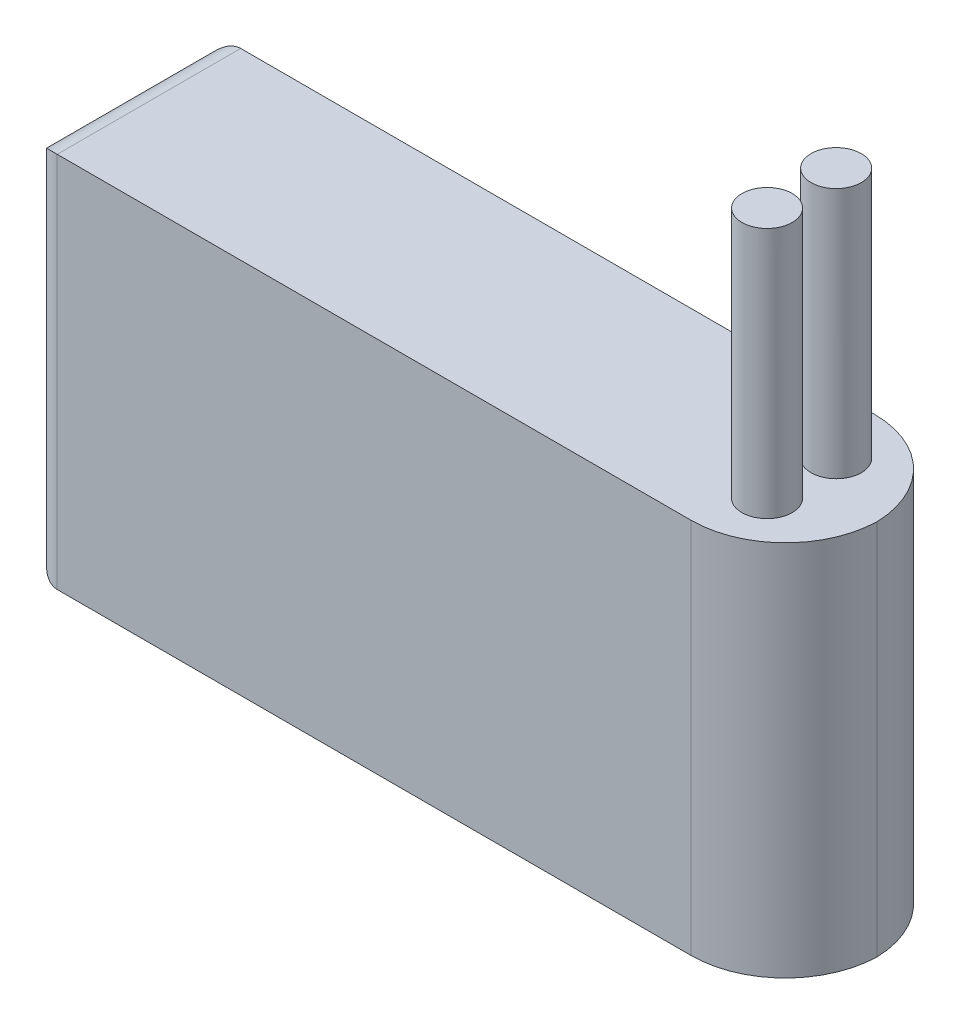
ISO-10303-21;
HEADER;
FILE_DESCRIPTION(('STEP AP214'),'2;1');
FILE_NAME('part.step','',(''),(''),'','','');
FILE_SCHEMA(('AUTOMOTIVE_DESIGN { 1 0 10303 214 1 1 1 1 }'));
ENDSEC;
DATA;
#1=APPLICATION_CONTEXT('core data for automotive mechanical design processes');
#2=APPLICATION_PROTOCOL_DEFINITION('international standard','automotive_design',2000,#1);
#3=PRODUCT_CONTEXT('',#1,'mechanical');
#4=PRODUCT('Part','Part','',(#3));
#5=PRODUCT_RELATED_PRODUCT_CATEGORY('part','',(#4));
#6=PRODUCT_DEFINITION_FORMATION('','',#4);
#7=PRODUCT_DEFINITION_CONTEXT('part definition',#1,'design');
#8=PRODUCT_DEFINITION('design','',#6,#7);
#9=PRODUCT_DEFINITION_SHAPE('','',#8);
#10=(LENGTH_UNIT() NAMED_UNIT(*) SI_UNIT(.MILLI.,.METRE.));
#11=(NAMED_UNIT(*) PLANE_ANGLE_UNIT() SI_UNIT($,.RADIAN.));
#12=(NAMED_UNIT(*) SI_UNIT($,.STERADIAN.) SOLID_ANGLE_UNIT());
#13=UNCERTAINTY_MEASURE_WITH_UNIT(LENGTH_MEASURE(1.E-05),#10,'distance_accuracy_value','');
#14=(GEOMETRIC_REPRESENTATION_CONTEXT(3) GLOBAL_UNCERTAINTY_ASSIGNED_CONTEXT((#13)) GLOBAL_UNIT_ASSIGNED_CONTEXT((#10,
#11,#12)) REPRESENTATION_CONTEXT('',''));
#15=CARTESIAN_POINT('',(0.,0.,0.));
#16=DIRECTION('',(0.,0.,1.));
#17=DIRECTION('',(1.,0.,0.));
#18=AXIS2_PLACEMENT_3D('',#15,#16,#17);
#19=CARTESIAN_POINT('',(0.,0.,18.542));
#20=DIRECTION('',(1.,0.,0.));
#21=DIRECTION('',(0.,0.,-1.));
#22=AXIS2_PLACEMENT_3D('',#19,#20,#21);
#23=PLANE('',#22);
#24=DIRECTION('',(0.,-1.,0.));
#25=VECTOR('',#24,1.);
#26=CARTESIAN_POINT('',(0.,0.,15.9385));
#27=LINE('',#26,#25);
#28=CARTESIAN_POINT('',(0.,2.6035,15.9385));
#29=VERTEX_POINT('',#28);
#30=CARTESIAN_POINT('',(0.,35.4965,15.9385));
#31=VERTEX_POINT('',#30);
#32=EDGE_CURVE('E159',#29,#31,#27,.F.);
#33=ORIENTED_EDGE('',*,*,#32,.T.);
#34=DIRECTION('',(0.,0.,-1.));
#35=VECTOR('',#34,1.);
#36=CARTESIAN_POINT('',(0.,35.4965,18.542));
#37=LINE('',#36,#35);
#38=CARTESIAN_POINT('',(0.,35.4965,2.6035));
#39=VERTEX_POINT('',#38);
#40=EDGE_CURVE('E162',#31,#39,#37,.T.);
#41=ORIENTED_EDGE('',*,*,#40,.T.);
#42=DIRECTION('',(0.,-1.,0.));
#43=VECTOR('',#42,1.);
#44=CARTESIAN_POINT('',(0.,0.,2.6035));
#45=LINE('',#44,#43);
#46=CARTESIAN_POINT('',(0.,2.6035,2.6035));
#47=VERTEX_POINT('',#46);
#48=EDGE_CURVE('E153',#39,#47,#45,.T.);
#49=ORIENTED_EDGE('',*,*,#48,.T.);
#50=DIRECTION('',(0.,0.,-1.));
#51=VECTOR('',#50,1.);
#52=CARTESIAN_POINT('',(0.,2.6035,18.542));
#53=LINE('',#52,#51);
#54=EDGE_CURVE('E156',#47,#29,#53,.F.);
#55=ORIENTED_EDGE('',*,*,#54,.T.);
#56=EDGE_LOOP('',(#33,#41,#49,#55));
#57=FACE_BOUND('',#56,.T.);
#58=ADVANCED_FACE('F41',(#57),#23,.F.);
#59=CARTESIAN_POINT('',(0.,0.,18.542));
#60=DIRECTION('',(0.,1.,0.));
#61=DIRECTION('',(0.,0.,1.));
#62=AXIS2_PLACEMENT_3D('',#59,#60,#61);
#63=PLANE('',#62);
#64=DIRECTION('',(1.,0.,0.));
#65=VECTOR('',#64,1.);
#66=CARTESIAN_POINT('',(0.,0.,18.542));
#67=LINE('',#66,#65);
#68=CARTESIAN_POINT('',(2.6035,0.,18.542));
#69=VERTEX_POINT('',#68);
#70=CARTESIAN_POINT('',(66.675,0.,18.542));
#71=VERTEX_POINT('',#70);
#72=EDGE_CURVE('E100',#69,#71,#67,.T.);
#73=ORIENTED_EDGE('',*,*,#72,.F.);
#74=DIRECTION('',(0.,0.,-1.));
#75=VECTOR('',#74,1.);
#76=CARTESIAN_POINT('',(2.6035,0.,18.542));
#77=LINE('',#76,#75);
#78=CARTESIAN_POINT('',(2.6035,0.,0.));
#79=VERTEX_POINT('',#78);
#80=EDGE_CURVE('E51',#69,#79,#77,.T.);
#81=ORIENTED_EDGE('',*,*,#80,.T.);
#82=DIRECTION('',(1.,0.,0.));
#83=VECTOR('',#82,1.);
#84=CARTESIAN_POINT('',(0.,0.,0.));
#85=LINE('',#84,#83);
#86=CARTESIAN_POINT('',(66.675,0.,0.));
#87=VERTEX_POINT('',#86);
#88=EDGE_CURVE('E144',#79,#87,#85,.T.);
#89=ORIENTED_EDGE('',*,*,#88,.T.);
#90=CARTESIAN_POINT('',(66.675,0.,9.525));
#91=DIRECTION('',(0.,1.,0.));
#92=DIRECTION('',(0.,0.,1.));
#93=AXIS2_PLACEMENT_3D('',#90,#91,#92);
#94=CIRCLE('',#93,9.525);
#95=CARTESIAN_POINT('',(76.1966127310451,0.,9.271));
#96=VERTEX_POINT('',#95);
#97=EDGE_CURVE('E114',#87,#96,#94,.F.);
#98=ORIENTED_EDGE('',*,*,#97,.T.);
#99=CARTESIAN_POINT('',(66.675,0.,9.017));
#100=DIRECTION('',(0.,1.,0.));
#101=DIRECTION('',(0.,0.,1.));
#102=AXIS2_PLACEMENT_3D('',#99,#100,#101);
#103=CIRCLE('',#102,9.525);
#104=EDGE_CURVE('E111',#96,#71,#103,.F.);
#105=ORIENTED_EDGE('',*,*,#104,.T.);
#106=EDGE_LOOP('',(#73,#81,#89,#98,#105));
#107=FACE_BOUND('',#106,.T.);
#108=ADVANCED_FACE('F112',(#107),#63,.F.);
#109=CARTESIAN_POINT('',(0.,38.1,18.542));
#110=DIRECTION('',(0.,-1.,0.));
#111=DIRECTION('',(0.,0.,-1.));
#112=AXIS2_PLACEMENT_3D('',#109,#110,#111);
#113=PLANE('',#112);
#114=CARTESIAN_POINT('',(68.5766127310451,38.1,12.7635));
#115=DIRECTION('',(0.,-1.,0.));
#116=DIRECTION('',(0.,0.,-1.));
#117=AXIS2_PLACEMENT_3D('',#114,#115,#116);
#118=CIRCLE('',#117,2.54);
#119=CARTESIAN_POINT('',(68.5766127310451,38.1,10.2235));
#120=VERTEX_POINT('',#119);
#121=EDGE_CURVE('E149',#120,#120,#118,.F.);
#122=ORIENTED_EDGE('',*,*,#121,.F.);
#123=EDGE_LOOP('',(#122));
#124=FACE_BOUND('',#123,.T.);
#125=CARTESIAN_POINT('',(68.5766127310451,38.1,5.7785));
#126=DIRECTION('',(0.,-1.,0.));
#127=DIRECTION('',(0.,0.,-1.));
#128=AXIS2_PLACEMENT_3D('',#125,#126,#127);
#129=CIRCLE('',#128,2.54);
#130=CARTESIAN_POINT('',(68.5766127310451,38.1,3.2385));
#131=VERTEX_POINT('',#130);
#132=EDGE_CURVE('E140',#131,#131,#129,.F.);
#133=ORIENTED_EDGE('',*,*,#132,.F.);
#134=EDGE_LOOP('',(#133));
#135=FACE_BOUND('',#134,.T.);
#136=DIRECTION('',(-1.,0.,0.));
#137=VECTOR('',#136,1.);
#138=CARTESIAN_POINT('',(0.,38.1,0.));
#139=LINE('',#138,#137);
#140=CARTESIAN_POINT('',(66.675,38.1,0.));
#141=VERTEX_POINT('',#140);
#142=CARTESIAN_POINT('',(2.6035,38.1,0.));
#143=VERTEX_POINT('',#142);
#144=EDGE_CURVE('E108',#141,#143,#139,.T.);
#145=ORIENTED_EDGE('',*,*,#144,.T.);
#146=DIRECTION('',(0.,0.,-1.));
#147=VECTOR('',#146,1.);
#148=CARTESIAN_POINT('',(2.6035,38.1,18.542));
#149=LINE('',#148,#147);
#150=CARTESIAN_POINT('',(2.6035,38.1,18.542));
#151=VERTEX_POINT('',#150);
#152=EDGE_CURVE('E166',#143,#151,#149,.F.);
#153=ORIENTED_EDGE('',*,*,#152,.T.);
#154=DIRECTION('',(-1.,0.,0.));
#155=VECTOR('',#154,1.);
#156=CARTESIAN_POINT('',(0.,38.1,18.542));
#157=LINE('',#156,#155);
#158=CARTESIAN_POINT('',(66.675,38.1,18.542));
#159=VERTEX_POINT('',#158);
#160=EDGE_CURVE('E107',#159,#151,#157,.T.);
#161=ORIENTED_EDGE('',*,*,#160,.F.);
#162=CARTESIAN_POINT('',(66.675,38.1,9.017));
#163=DIRECTION('',(0.,-1.,0.));
#164=DIRECTION('',(0.,0.,-1.));
#165=AXIS2_PLACEMENT_3D('',#162,#163,#164);
#166=CIRCLE('',#165,9.525);
#167=CARTESIAN_POINT('',(76.1966127310451,38.1,9.271));
#168=VERTEX_POINT('',#167);
#169=EDGE_CURVE('E122',#159,#168,#166,.F.);
#170=ORIENTED_EDGE('',*,*,#169,.T.);
#171=CARTESIAN_POINT('',(66.675,38.1,9.525));
#172=DIRECTION('',(0.,-1.,0.));
#173=DIRECTION('',(0.,0.,-1.));
#174=AXIS2_PLACEMENT_3D('',#171,#172,#173);
#175=CIRCLE('',#174,9.525);
#176=EDGE_CURVE('E124',#168,#141,#175,.F.);
#177=ORIENTED_EDGE('',*,*,#176,.T.);
#178=EDGE_LOOP('',(#145,#153,#161,#170,#177));
#179=FACE_BOUND('',#178,.T.);
#180=ADVANCED_FACE('F206',(#124,#135,#179),#113,.F.);
#181=CARTESIAN_POINT('',(0.,0.,18.542));
#182=DIRECTION('',(0.,0.,-1.));
#183=DIRECTION('',(-1.,0.,0.));
#184=AXIS2_PLACEMENT_3D('',#181,#182,#183);
#185=PLANE('',#184);
#186=ORIENTED_EDGE('',*,*,#160,.T.);
#187=DIRECTION('',(0.,-1.,0.));
#188=VECTOR('',#187,1.);
#189=CARTESIAN_POINT('',(2.6035,0.,18.542));
#190=LINE('',#189,#188);
#191=EDGE_CURVE('E66',#151,#69,#190,.T.);
#192=ORIENTED_EDGE('',*,*,#191,.T.);
#193=ORIENTED_EDGE('',*,*,#72,.T.);
#194=DIRECTION('',(0.,1.,0.));
#195=VECTOR('',#194,1.);
#196=CARTESIAN_POINT('',(66.675,0.,18.542));
#197=LINE('',#196,#195);
#198=EDGE_CURVE('E104',#71,#159,#197,.T.);
#199=ORIENTED_EDGE('',*,*,#198,.T.);
#200=EDGE_LOOP('',(#186,#192,#193,#199));
#201=FACE_BOUND('',#200,.T.);
#202=ADVANCED_FACE('F102',(#201),#185,.F.);
#203=CARTESIAN_POINT('',(0.,0.,0.));
#204=DIRECTION('',(0.,0.,-1.));
#205=DIRECTION('',(-1.,0.,0.));
#206=AXIS2_PLACEMENT_3D('',#203,#204,#205);
#207=PLANE('',#206);
#208=ORIENTED_EDGE('',*,*,#88,.F.);
#209=DIRECTION('',(0.,-1.,0.));
#210=VECTOR('',#209,1.);
#211=CARTESIAN_POINT('',(2.6035,38.1,0.));
#212=LINE('',#211,#210);
#213=EDGE_CURVE('E11',#79,#143,#212,.F.);
#214=ORIENTED_EDGE('',*,*,#213,.T.);
#215=ORIENTED_EDGE('',*,*,#144,.F.);
#216=DIRECTION('',(0.,1.,0.));
#217=VECTOR('',#216,1.);
#218=CARTESIAN_POINT('',(66.675,0.,0.));
#219=LINE('',#218,#217);
#220=EDGE_CURVE('E119',#141,#87,#219,.F.);
#221=ORIENTED_EDGE('',*,*,#220,.T.);
#222=EDGE_LOOP('',(#208,#214,#215,#221));
#223=FACE_BOUND('',#222,.T.);
#224=ADVANCED_FACE('F241',(#223),#207,.T.);
#225=CARTESIAN_POINT('',(66.675,0.,9.525));
#226=DIRECTION('',(0.,-1.,0.));
#227=DIRECTION('',(0.,0.,-1.));
#228=AXIS2_PLACEMENT_3D('',#225,#226,#227);
#229=CYLINDRICAL_SURFACE('',#228,9.525);
#230=DIRECTION('',(0.,-1.,0.));
#231=VECTOR('',#230,1.);
#232=CARTESIAN_POINT('',(76.1966127310451,19.05,9.271));
#233=LINE('',#232,#231);
#234=EDGE_CURVE('E141',#96,#168,#233,.F.);
#235=ORIENTED_EDGE('',*,*,#234,.F.);
#236=ORIENTED_EDGE('',*,*,#97,.F.);
#237=ORIENTED_EDGE('',*,*,#220,.F.);
#238=ORIENTED_EDGE('',*,*,#176,.F.);
#239=EDGE_LOOP('',(#235,#236,#237,#238));
#240=FACE_BOUND('',#239,.T.);
#241=ADVANCED_FACE('F238',(#240),#229,.T.);
#242=CARTESIAN_POINT('',(66.675,0.,9.017));
#243=DIRECTION('',(0.,1.,0.));
#244=DIRECTION('',(0.,0.,1.));
#245=AXIS2_PLACEMENT_3D('',#242,#243,#244);
#246=CYLINDRICAL_SURFACE('',#245,9.525);
#247=ORIENTED_EDGE('',*,*,#104,.F.);
#248=ORIENTED_EDGE('',*,*,#234,.T.);
#249=ORIENTED_EDGE('',*,*,#169,.F.);
#250=ORIENTED_EDGE('',*,*,#198,.F.);
#251=EDGE_LOOP('',(#247,#248,#249,#250));
#252=FACE_BOUND('',#251,.T.);
#253=ADVANCED_FACE('F121',(#252),#246,.T.);
#254=CARTESIAN_POINT('',(68.5766127310451,63.5,5.7785));
#255=DIRECTION('',(0.,-1.,0.));
#256=DIRECTION('',(0.,0.,-1.));
#257=AXIS2_PLACEMENT_3D('',#254,#255,#256);
#258=CYLINDRICAL_SURFACE('',#257,2.54);
#259=CARTESIAN_POINT('',(68.5766127310451,63.5,5.7785));
#260=DIRECTION('',(0.,1.,0.));
#261=DIRECTION('',(0.,0.,1.));
#262=AXIS2_PLACEMENT_3D('',#259,#260,#261);
#263=CIRCLE('',#262,2.54);
#264=CARTESIAN_POINT('',(68.5766127310451,63.5,8.31849999999999));
#265=VERTEX_POINT('',#264);
#266=EDGE_CURVE('E145',#265,#265,#263,.T.);
#267=ORIENTED_EDGE('',*,*,#266,.F.);
#268=EDGE_LOOP('',(#267));
#269=FACE_BOUND('',#268,.T.);
#270=ORIENTED_EDGE('',*,*,#132,.T.);
#271=EDGE_LOOP('',(#270));
#272=FACE_BOUND('',#271,.T.);
#273=ADVANCED_FACE('F237',(#269,#272),#258,.T.);
#274=CARTESIAN_POINT('',(68.5766127310451,63.5,5.7785));
#275=DIRECTION('',(0.,1.,0.));
#276=DIRECTION('',(0.,0.,1.));
#277=AXIS2_PLACEMENT_3D('',#274,#275,#276);
#278=PLANE('',#277);
#279=ORIENTED_EDGE('',*,*,#266,.T.);
#280=EDGE_LOOP('',(#279));
#281=FACE_BOUND('',#280,.T.);
#282=ADVANCED_FACE('F314',(#281),#278,.T.);
#283=CARTESIAN_POINT('',(68.5766127310451,63.5,12.7635));
#284=DIRECTION('',(0.,-1.,0.));
#285=DIRECTION('',(0.,0.,-1.));
#286=AXIS2_PLACEMENT_3D('',#283,#284,#285);
#287=CYLINDRICAL_SURFACE('',#286,2.54);
#288=CARTESIAN_POINT('',(68.5766127310451,63.5,12.7635));
#289=DIRECTION('',(0.,1.,0.));
#290=DIRECTION('',(0.,0.,1.));
#291=AXIS2_PLACEMENT_3D('',#288,#289,#290);
#292=CIRCLE('',#291,2.54);
#293=CARTESIAN_POINT('',(68.5766127310451,63.5,15.3035));
#294=VERTEX_POINT('',#293);
#295=EDGE_CURVE('E188',#294,#294,#292,.T.);
#296=ORIENTED_EDGE('',*,*,#295,.F.);
#297=EDGE_LOOP('',(#296));
#298=FACE_BOUND('',#297,.T.);
#299=ORIENTED_EDGE('',*,*,#121,.T.);
#300=EDGE_LOOP('',(#299));
#301=FACE_BOUND('',#300,.T.);
#302=ADVANCED_FACE('F304',(#298,#301),#287,.T.);
#303=CARTESIAN_POINT('',(68.5766127310451,63.5,12.7635));
#304=DIRECTION('',(0.,1.,0.));
#305=DIRECTION('',(0.,0.,1.));
#306=AXIS2_PLACEMENT_3D('',#303,#304,#305);
#307=PLANE('',#306);
#308=ORIENTED_EDGE('',*,*,#295,.T.);
#309=EDGE_LOOP('',(#308));
#310=FACE_BOUND('',#309,.T.);
#311=ADVANCED_FACE('F225',(#310),#307,.T.);
#312=CARTESIAN_POINT('',(2.6035,2.6035,18.542));
#313=DIRECTION('',(0.,0.,-1.));
#314=DIRECTION('',(-1.,0.,0.));
#315=AXIS2_PLACEMENT_3D('',#312,#313,#314);
#316=CYLINDRICAL_SURFACE('',#315,2.6035);
#317=CARTESIAN_POINT('',(2.6035,2.6035,2.6035));
#318=DIRECTION('',(0.,0.707106781186547,-0.707106781186547));
#319=DIRECTION('',(0.,0.707106781186547,0.707106781186547));
#320=AXIS2_PLACEMENT_3D('',#317,#318,#319);
#321=ELLIPSE('',#320,3.68190500963835,2.6035);
#322=EDGE_CURVE('E179',#79,#47,#321,.T.);
#323=ORIENTED_EDGE('',*,*,#322,.F.);
#324=ORIENTED_EDGE('',*,*,#80,.F.);
#325=CARTESIAN_POINT('',(2.6035,2.6035,15.9385));
#326=DIRECTION('',(0.,-0.707106781186547,-0.707106781186547));
#327=DIRECTION('',(0.,0.707106781186547,-0.707106781186547));
#328=AXIS2_PLACEMENT_3D('',#325,#326,#327);
#329=ELLIPSE('',#328,3.68190500963835,2.6035);
#330=EDGE_CURVE('E45',#29,#69,#329,.F.);
#331=ORIENTED_EDGE('',*,*,#330,.F.);
#332=ORIENTED_EDGE('',*,*,#54,.F.);
#333=EDGE_LOOP('',(#323,#324,#331,#332));
#334=FACE_BOUND('',#333,.T.);
#335=ADVANCED_FACE('F43',(#334),#316,.T.);
#336=CARTESIAN_POINT('',(2.6035,0.,15.9385));
#337=DIRECTION('',(0.,-1.,0.));
#338=DIRECTION('',(0.,0.,-1.));
#339=AXIS2_PLACEMENT_3D('',#336,#337,#338);
#340=CYLINDRICAL_SURFACE('',#339,2.6035);
#341=ORIENTED_EDGE('',*,*,#330,.T.);
#342=ORIENTED_EDGE('',*,*,#191,.F.);
#343=CARTESIAN_POINT('',(2.6035,35.4965,15.9385));
#344=DIRECTION('',(0.,-0.707106781186547,0.707106781186547));
#345=DIRECTION('',(0.,-0.707106781186547,-0.707106781186547));
#346=AXIS2_PLACEMENT_3D('',#343,#344,#345);
#347=ELLIPSE('',#346,3.68190500963835,2.6035);
#348=EDGE_CURVE('E177',#31,#151,#347,.F.);
#349=ORIENTED_EDGE('',*,*,#348,.F.);
#350=ORIENTED_EDGE('',*,*,#32,.F.);
#351=EDGE_LOOP('',(#341,#342,#349,#350));
#352=FACE_BOUND('',#351,.T.);
#353=ADVANCED_FACE('F218',(#352),#340,.T.);
#354=CARTESIAN_POINT('',(2.6035,0.,2.6035));
#355=DIRECTION('',(0.,1.,0.));
#356=DIRECTION('',(0.,0.,1.));
#357=AXIS2_PLACEMENT_3D('',#354,#355,#356);
#358=CYLINDRICAL_SURFACE('',#357,2.6035);
#359=ORIENTED_EDGE('',*,*,#322,.T.);
#360=ORIENTED_EDGE('',*,*,#48,.F.);
#361=CARTESIAN_POINT('',(2.6035,35.4965,2.6035));
#362=DIRECTION('',(0.,0.707106781186547,0.707106781186547));
#363=DIRECTION('',(0.,0.707106781186547,-0.707106781186547));
#364=AXIS2_PLACEMENT_3D('',#361,#362,#363);
#365=ELLIPSE('',#364,3.68190500963835,2.6035);
#366=EDGE_CURVE('E174',#143,#39,#365,.T.);
#367=ORIENTED_EDGE('',*,*,#366,.F.);
#368=ORIENTED_EDGE('',*,*,#213,.F.);
#369=EDGE_LOOP('',(#359,#360,#367,#368));
#370=FACE_BOUND('',#369,.T.);
#371=ADVANCED_FACE('F215',(#370),#358,.T.);
#372=CARTESIAN_POINT('',(2.6035,35.4965,18.542));
#373=DIRECTION('',(0.,0.,-1.));
#374=DIRECTION('',(-1.,0.,0.));
#375=AXIS2_PLACEMENT_3D('',#372,#373,#374);
#376=CYLINDRICAL_SURFACE('',#375,2.6035);
#377=ORIENTED_EDGE('',*,*,#348,.T.);
#378=ORIENTED_EDGE('',*,*,#152,.F.);
#379=ORIENTED_EDGE('',*,*,#366,.T.);
#380=ORIENTED_EDGE('',*,*,#40,.F.);
#381=EDGE_LOOP('',(#377,#378,#379,#380));
#382=FACE_BOUND('',#381,.T.);
#383=ADVANCED_FACE('F212',(#382),#376,.T.);
#384=CLOSED_SHELL('',(#58,#108,#180,#202,#224,#241,#253,#273,#282,#302,#311,#335,#353,#371,#383));
#385=MANIFOLD_SOLID_BREP('B2',#384);
#386=ADVANCED_BREP_SHAPE_REPRESENTATION('',(#18,#385),#14);
#387=SHAPE_DEFINITION_REPRESENTATION(#9,#386);
ENDSEC;
END-ISO-10303-21;
